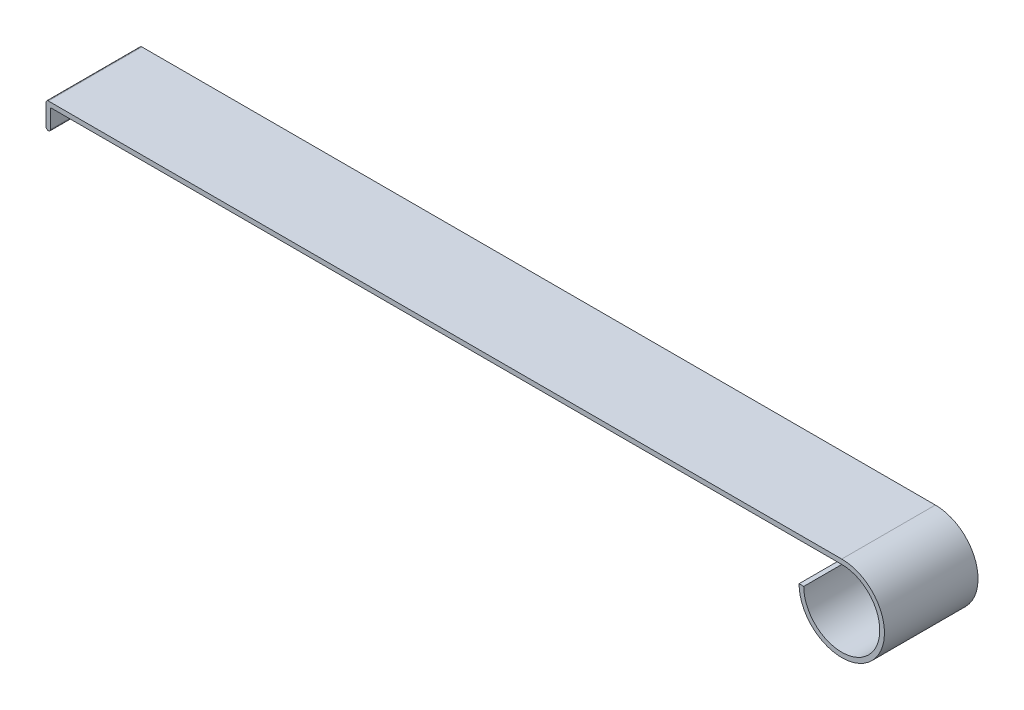
ISO-10303-21;
HEADER;
FILE_DESCRIPTION(('STEP AP214'),'2;1');
FILE_NAME('part.step','',(''),(''),'','','');
FILE_SCHEMA(('AUTOMOTIVE_DESIGN { 1 0 10303 214 1 1 1 1 }'));
ENDSEC;
DATA;
#1=APPLICATION_CONTEXT('core data for automotive mechanical design processes');
#2=APPLICATION_PROTOCOL_DEFINITION('international standard','automotive_design',2000,#1);
#3=PRODUCT_CONTEXT('',#1,'mechanical');
#4=PRODUCT('Part','Part','',(#3));
#5=PRODUCT_RELATED_PRODUCT_CATEGORY('part','',(#4));
#6=PRODUCT_DEFINITION_FORMATION('','',#4);
#7=PRODUCT_DEFINITION_CONTEXT('part definition',#1,'design');
#8=PRODUCT_DEFINITION('design','',#6,#7);
#9=PRODUCT_DEFINITION_SHAPE('','',#8);
#10=(LENGTH_UNIT() NAMED_UNIT(*) SI_UNIT(.MILLI.,.METRE.));
#11=(NAMED_UNIT(*) PLANE_ANGLE_UNIT() SI_UNIT($,.RADIAN.));
#12=(NAMED_UNIT(*) SI_UNIT($,.STERADIAN.) SOLID_ANGLE_UNIT());
#13=UNCERTAINTY_MEASURE_WITH_UNIT(LENGTH_MEASURE(1.E-05),#10,'distance_accuracy_value','');
#14=(GEOMETRIC_REPRESENTATION_CONTEXT(3) GLOBAL_UNCERTAINTY_ASSIGNED_CONTEXT((#13)) GLOBAL_UNIT_ASSIGNED_CONTEXT((#10,
#11,#12)) REPRESENTATION_CONTEXT('',''));
#15=CARTESIAN_POINT('',(0.,0.,0.));
#16=DIRECTION('',(0.,0.,1.));
#17=DIRECTION('',(1.,0.,0.));
#18=AXIS2_PLACEMENT_3D('',#15,#16,#17);
#19=CARTESIAN_POINT('',(0.,0.,4.));
#20=DIRECTION('',(0.,0.,-1.));
#21=DIRECTION('',(-1.,0.,0.));
#22=AXIS2_PLACEMENT_3D('',#19,#20,#21);
#23=CYLINDRICAL_SURFACE('',#22,0.1);
#24=CARTESIAN_POINT('',(0.,0.,0.));
#25=DIRECTION('',(0.,0.,1.));
#26=DIRECTION('',(1.,0.,0.));
#27=AXIS2_PLACEMENT_3D('',#24,#25,#26);
#28=CIRCLE('',#27,0.1);
#29=CARTESIAN_POINT('',(-0.1,0.,0.));
#30=VERTEX_POINT('',#29);
#31=CARTESIAN_POINT('',(0.1,0.,0.));
#32=VERTEX_POINT('',#31);
#33=EDGE_CURVE('E136',#30,#32,#28,.T.);
#34=ORIENTED_EDGE('',*,*,#33,.T.);
#35=DIRECTION('',(0.,0.,-1.));
#36=VECTOR('',#35,1.);
#37=CARTESIAN_POINT('',(0.1,0.,4.));
#38=LINE('',#37,#36);
#39=CARTESIAN_POINT('',(0.1,0.,4.));
#40=VERTEX_POINT('',#39);
#41=EDGE_CURVE('E11',#40,#32,#38,.T.);
#42=ORIENTED_EDGE('',*,*,#41,.F.);
#43=CARTESIAN_POINT('',(0.,0.,4.));
#44=DIRECTION('',(0.,0.,1.));
#45=DIRECTION('',(1.,0.,0.));
#46=AXIS2_PLACEMENT_3D('',#43,#44,#45);
#47=CIRCLE('',#46,0.1);
#48=CARTESIAN_POINT('',(-0.1,0.,4.));
#49=VERTEX_POINT('',#48);
#50=EDGE_CURVE('E154',#49,#40,#47,.T.);
#51=ORIENTED_EDGE('',*,*,#50,.F.);
#52=DIRECTION('',(0.,0.,-1.));
#53=VECTOR('',#52,1.);
#54=CARTESIAN_POINT('',(-0.1,0.,4.));
#55=LINE('',#54,#53);
#56=EDGE_CURVE('E132',#49,#30,#55,.T.);
#57=ORIENTED_EDGE('',*,*,#56,.T.);
#58=EDGE_LOOP('',(#34,#42,#51,#57));
#59=FACE_BOUND('',#58,.T.);
#60=ADVANCED_FACE('F33',(#59),#23,.T.);
#61=CARTESIAN_POINT('',(0.1,0.,4.));
#62=DIRECTION('',(-1.,0.,0.));
#63=DIRECTION('',(0.,0.,1.));
#64=AXIS2_PLACEMENT_3D('',#61,#62,#63);
#65=PLANE('',#64);
#66=DIRECTION('',(0.,1.,0.));
#67=VECTOR('',#66,1.);
#68=CARTESIAN_POINT('',(0.1,0.,0.));
#69=LINE('',#68,#67);
#70=CARTESIAN_POINT('',(0.1,0.8,0.));
#71=VERTEX_POINT('',#70);
#72=EDGE_CURVE('E139',#32,#71,#69,.T.);
#73=ORIENTED_EDGE('',*,*,#72,.T.);
#74=DIRECTION('',(0.,0.,-1.));
#75=VECTOR('',#74,1.);
#76=CARTESIAN_POINT('',(0.1,0.8,4.));
#77=LINE('',#76,#75);
#78=CARTESIAN_POINT('',(0.1,0.8,4.));
#79=VERTEX_POINT('',#78);
#80=EDGE_CURVE('E41',#79,#71,#77,.T.);
#81=ORIENTED_EDGE('',*,*,#80,.F.);
#82=DIRECTION('',(0.,1.,0.));
#83=VECTOR('',#82,1.);
#84=CARTESIAN_POINT('',(0.1,0.,4.));
#85=LINE('',#84,#83);
#86=EDGE_CURVE('E93',#40,#79,#85,.T.);
#87=ORIENTED_EDGE('',*,*,#86,.F.);
#88=ORIENTED_EDGE('',*,*,#41,.T.);
#89=EDGE_LOOP('',(#73,#81,#87,#88));
#90=FACE_BOUND('',#89,.T.);
#91=ADVANCED_FACE('F172',(#90),#65,.F.);
#92=CARTESIAN_POINT('',(33.077498182658,0.8,4.));
#93=DIRECTION('',(0.,1.,0.));
#94=DIRECTION('',(-1.,0.,0.));
#95=AXIS2_PLACEMENT_3D('',#92,#93,#94);
#96=PLANE('',#95);
#97=DIRECTION('',(1.,0.,0.));
#98=VECTOR('',#97,1.);
#99=CARTESIAN_POINT('',(33.077498182658,0.8,0.));
#100=LINE('',#99,#98);
#101=CARTESIAN_POINT('',(33.9080828748774,0.799999999999997,0.));
#102=VERTEX_POINT('',#101);
#103=EDGE_CURVE('E142',#71,#102,#100,.T.);
#104=ORIENTED_EDGE('',*,*,#103,.T.);
#105=DIRECTION('',(0.,0.,-1.));
#106=VECTOR('',#105,1.);
#107=CARTESIAN_POINT('',(33.9080828748774,0.799999999999997,4.));
#108=LINE('',#107,#106);
#109=CARTESIAN_POINT('',(33.9080828748774,0.799999999999997,4.));
#110=VERTEX_POINT('',#109);
#111=EDGE_CURVE('E164',#110,#102,#108,.T.);
#112=ORIENTED_EDGE('',*,*,#111,.F.);
#113=DIRECTION('',(1.,0.,0.));
#114=VECTOR('',#113,1.);
#115=CARTESIAN_POINT('',(0.1,0.8,4.));
#116=LINE('',#115,#114);
#117=EDGE_CURVE('E171',#79,#110,#116,.T.);
#118=ORIENTED_EDGE('',*,*,#117,.F.);
#119=ORIENTED_EDGE('',*,*,#80,.T.);
#120=EDGE_LOOP('',(#104,#112,#118,#119));
#121=FACE_BOUND('',#120,.T.);
#122=ADVANCED_FACE('F169',(#121),#96,.F.);
#123=CARTESIAN_POINT('',(33.9080828748774,-0.824677327373322,4.));
#124=DIRECTION('',(0.,0.,-1.));
#125=DIRECTION('',(-1.,0.,0.));
#126=AXIS2_PLACEMENT_3D('',#123,#124,#125);
#127=CYLINDRICAL_SURFACE('',#126,1.62467732737332);
#128=CARTESIAN_POINT('',(33.9080828748774,-0.824677327373322,0.));
#129=DIRECTION('',(0.,0.,-1.));
#130=DIRECTION('',(1.,0.,0.));
#131=AXIS2_PLACEMENT_3D('',#128,#129,#130);
#132=CIRCLE('',#131,1.62467732737332);
#133=CARTESIAN_POINT('',(32.2834055475041,-0.824677327373322,0.));
#134=VERTEX_POINT('',#133);
#135=EDGE_CURVE('E144',#102,#134,#132,.T.);
#136=ORIENTED_EDGE('',*,*,#135,.T.);
#137=DIRECTION('',(0.,0.,-1.));
#138=VECTOR('',#137,1.);
#139=CARTESIAN_POINT('',(32.2834055475041,-0.824677327373322,4.));
#140=LINE('',#139,#138);
#141=CARTESIAN_POINT('',(32.2834055475041,-0.824677327373322,4.));
#142=VERTEX_POINT('',#141);
#143=EDGE_CURVE('E161',#142,#134,#140,.T.);
#144=ORIENTED_EDGE('',*,*,#143,.F.);
#145=CARTESIAN_POINT('',(33.9080828748774,-0.824677327373322,4.));
#146=DIRECTION('',(0.,0.,-1.));
#147=DIRECTION('',(1.,0.,0.));
#148=AXIS2_PLACEMENT_3D('',#145,#146,#147);
#149=CIRCLE('',#148,1.62467732737332);
#150=EDGE_CURVE('E187',#110,#142,#149,.T.);
#151=ORIENTED_EDGE('',*,*,#150,.F.);
#152=ORIENTED_EDGE('',*,*,#111,.T.);
#153=EDGE_LOOP('',(#136,#144,#151,#152));
#154=FACE_BOUND('',#153,.T.);
#155=ADVANCED_FACE('F180',(#154),#127,.F.);
#156=CARTESIAN_POINT('',(32.2834055475041,-0.824677327373322,4.));
#157=DIRECTION('',(0.,-1.,0.));
#158=DIRECTION('',(0.,0.,-1.));
#159=AXIS2_PLACEMENT_3D('',#156,#157,#158);
#160=PLANE('',#159);
#161=DIRECTION('',(-1.,0.,0.));
#162=VECTOR('',#161,1.);
#163=CARTESIAN_POINT('',(32.2834055475041,-0.824677327373322,0.));
#164=LINE('',#163,#162);
#165=CARTESIAN_POINT('',(32.0834055475041,-0.824677327373322,0.));
#166=VERTEX_POINT('',#165);
#167=EDGE_CURVE('E146',#134,#166,#164,.T.);
#168=ORIENTED_EDGE('',*,*,#167,.T.);
#169=DIRECTION('',(0.,0.,-1.));
#170=VECTOR('',#169,1.);
#171=CARTESIAN_POINT('',(32.0834055475041,-0.824677327373322,4.));
#172=LINE('',#171,#170);
#173=CARTESIAN_POINT('',(32.0834055475041,-0.824677327373322,4.));
#174=VERTEX_POINT('',#173);
#175=EDGE_CURVE('E158',#174,#166,#172,.T.);
#176=ORIENTED_EDGE('',*,*,#175,.F.);
#177=DIRECTION('',(-1.,0.,0.));
#178=VECTOR('',#177,1.);
#179=CARTESIAN_POINT('',(32.2834055475041,-0.824677327373322,4.));
#180=LINE('',#179,#178);
#181=EDGE_CURVE('E186',#142,#174,#180,.T.);
#182=ORIENTED_EDGE('',*,*,#181,.F.);
#183=ORIENTED_EDGE('',*,*,#143,.T.);
#184=EDGE_LOOP('',(#168,#176,#182,#183));
#185=FACE_BOUND('',#184,.T.);
#186=ADVANCED_FACE('F184',(#185),#160,.F.);
#187=CARTESIAN_POINT('',(33.9080828748774,-0.824677327373322,4.));
#188=DIRECTION('',(0.,0.,-1.));
#189=DIRECTION('',(-1.,0.,0.));
#190=AXIS2_PLACEMENT_3D('',#187,#188,#189);
#191=CYLINDRICAL_SURFACE('',#190,1.82467732737332);
#192=CARTESIAN_POINT('',(33.9080828748774,-0.824677327373322,0.));
#193=DIRECTION('',(0.,0.,1.));
#194=DIRECTION('',(1.,0.,0.));
#195=AXIS2_PLACEMENT_3D('',#192,#193,#194);
#196=CIRCLE('',#195,1.82467732737332);
#197=CARTESIAN_POINT('',(33.9080828748774,0.999999999999999,0.));
#198=VERTEX_POINT('',#197);
#199=EDGE_CURVE('E148',#166,#198,#196,.T.);
#200=ORIENTED_EDGE('',*,*,#199,.T.);
#201=DIRECTION('',(0.,0.,-1.));
#202=VECTOR('',#201,1.);
#203=CARTESIAN_POINT('',(33.9080828748774,0.999999999999999,4.));
#204=LINE('',#203,#202);
#205=CARTESIAN_POINT('',(33.9080828748774,0.999999999999999,4.));
#206=VERTEX_POINT('',#205);
#207=EDGE_CURVE('E127',#206,#198,#204,.T.);
#208=ORIENTED_EDGE('',*,*,#207,.F.);
#209=CARTESIAN_POINT('',(33.9080828748774,-0.824677327373322,4.));
#210=DIRECTION('',(0.,0.,1.));
#211=DIRECTION('',(1.,0.,0.));
#212=AXIS2_PLACEMENT_3D('',#209,#210,#211);
#213=CIRCLE('',#212,1.82467732737332);
#214=EDGE_CURVE('E116',#174,#206,#213,.T.);
#215=ORIENTED_EDGE('',*,*,#214,.F.);
#216=ORIENTED_EDGE('',*,*,#175,.T.);
#217=EDGE_LOOP('',(#200,#208,#215,#216));
#218=FACE_BOUND('',#217,.T.);
#219=ADVANCED_FACE('F218',(#218),#191,.T.);
#220=CARTESIAN_POINT('',(0.,1.,4.));
#221=DIRECTION('',(0.,-1.,0.));
#222=DIRECTION('',(0.,0.,-1.));
#223=AXIS2_PLACEMENT_3D('',#220,#221,#222);
#224=PLANE('',#223);
#225=DIRECTION('',(-1.,0.,0.));
#226=VECTOR('',#225,1.);
#227=CARTESIAN_POINT('',(0.,1.,0.));
#228=LINE('',#227,#226);
#229=CARTESIAN_POINT('',(0.,1.,0.));
#230=VERTEX_POINT('',#229);
#231=EDGE_CURVE('E125',#198,#230,#228,.T.);
#232=ORIENTED_EDGE('',*,*,#231,.T.);
#233=DIRECTION('',(0.,0.,-1.));
#234=VECTOR('',#233,1.);
#235=CARTESIAN_POINT('',(0.,1.,4.));
#236=LINE('',#235,#234);
#237=CARTESIAN_POINT('',(0.,1.,4.));
#238=VERTEX_POINT('',#237);
#239=EDGE_CURVE('E122',#238,#230,#236,.T.);
#240=ORIENTED_EDGE('',*,*,#239,.F.);
#241=DIRECTION('',(-1.,0.,0.));
#242=VECTOR('',#241,1.);
#243=CARTESIAN_POINT('',(0.,1.,4.));
#244=LINE('',#243,#242);
#245=EDGE_CURVE('E109',#206,#238,#244,.T.);
#246=ORIENTED_EDGE('',*,*,#245,.F.);
#247=ORIENTED_EDGE('',*,*,#207,.T.);
#248=EDGE_LOOP('',(#232,#240,#246,#247));
#249=FACE_BOUND('',#248,.T.);
#250=ADVANCED_FACE('F123',(#249),#224,.F.);
#251=CARTESIAN_POINT('',(0.,0.9,4.));
#252=DIRECTION('',(0.,0.,-1.));
#253=DIRECTION('',(-1.,0.,0.));
#254=AXIS2_PLACEMENT_3D('',#251,#252,#253);
#255=CYLINDRICAL_SURFACE('',#254,0.1);
#256=CARTESIAN_POINT('',(0.,0.9,0.));
#257=DIRECTION('',(0.,0.,1.));
#258=DIRECTION('',(1.,0.,0.));
#259=AXIS2_PLACEMENT_3D('',#256,#257,#258);
#260=CIRCLE('',#259,0.1);
#261=CARTESIAN_POINT('',(-0.1,0.9,0.));
#262=VERTEX_POINT('',#261);
#263=EDGE_CURVE('E151',#230,#262,#260,.T.);
#264=ORIENTED_EDGE('',*,*,#263,.T.);
#265=DIRECTION('',(0.,0.,-1.));
#266=VECTOR('',#265,1.);
#267=CARTESIAN_POINT('',(-0.1,0.9,4.));
#268=LINE('',#267,#266);
#269=CARTESIAN_POINT('',(-0.1,0.9,4.));
#270=VERTEX_POINT('',#269);
#271=EDGE_CURVE('E128',#270,#262,#268,.T.);
#272=ORIENTED_EDGE('',*,*,#271,.F.);
#273=CARTESIAN_POINT('',(0.,0.9,4.));
#274=DIRECTION('',(0.,0.,1.));
#275=DIRECTION('',(1.,0.,0.));
#276=AXIS2_PLACEMENT_3D('',#273,#274,#275);
#277=CIRCLE('',#276,0.1);
#278=EDGE_CURVE('E113',#238,#270,#277,.T.);
#279=ORIENTED_EDGE('',*,*,#278,.F.);
#280=ORIENTED_EDGE('',*,*,#239,.T.);
#281=EDGE_LOOP('',(#264,#272,#279,#280));
#282=FACE_BOUND('',#281,.T.);
#283=ADVANCED_FACE('F130',(#282),#255,.T.);
#284=CARTESIAN_POINT('',(-0.1,0.,4.));
#285=DIRECTION('',(1.,0.,0.));
#286=DIRECTION('',(0.,0.,-1.));
#287=AXIS2_PLACEMENT_3D('',#284,#285,#286);
#288=PLANE('',#287);
#289=DIRECTION('',(0.,-1.,0.));
#290=VECTOR('',#289,1.);
#291=CARTESIAN_POINT('',(-0.1,0.,0.));
#292=LINE('',#291,#290);
#293=EDGE_CURVE('E81',#262,#30,#292,.T.);
#294=ORIENTED_EDGE('',*,*,#293,.T.);
#295=ORIENTED_EDGE('',*,*,#56,.F.);
#296=DIRECTION('',(0.,-1.,0.));
#297=VECTOR('',#296,1.);
#298=CARTESIAN_POINT('',(-0.1,0.8,4.));
#299=LINE('',#298,#297);
#300=EDGE_CURVE('E49',#270,#49,#299,.T.);
#301=ORIENTED_EDGE('',*,*,#300,.F.);
#302=ORIENTED_EDGE('',*,*,#271,.T.);
#303=EDGE_LOOP('',(#294,#295,#301,#302));
#304=FACE_BOUND('',#303,.T.);
#305=ADVANCED_FACE('F195',(#304),#288,.F.);
#306=CARTESIAN_POINT('',(0.,0.,4.));
#307=DIRECTION('',(0.,0.,1.));
#308=DIRECTION('',(1.,0.,0.));
#309=AXIS2_PLACEMENT_3D('',#306,#307,#308);
#310=PLANE('',#309);
#311=ORIENTED_EDGE('',*,*,#50,.T.);
#312=ORIENTED_EDGE('',*,*,#86,.T.);
#313=ORIENTED_EDGE('',*,*,#117,.T.);
#314=ORIENTED_EDGE('',*,*,#150,.T.);
#315=ORIENTED_EDGE('',*,*,#181,.T.);
#316=ORIENTED_EDGE('',*,*,#214,.T.);
#317=ORIENTED_EDGE('',*,*,#245,.T.);
#318=ORIENTED_EDGE('',*,*,#278,.T.);
#319=ORIENTED_EDGE('',*,*,#300,.T.);
#320=EDGE_LOOP('',(#311,#312,#313,#314,#315,#316,#317,#318,#319));
#321=FACE_BOUND('',#320,.T.);
#322=ADVANCED_FACE('F111',(#321),#310,.T.);
#323=CARTESIAN_POINT('',(0.,0.,0.));
#324=DIRECTION('',(0.,0.,1.));
#325=DIRECTION('',(1.,0.,0.));
#326=AXIS2_PLACEMENT_3D('',#323,#324,#325);
#327=PLANE('',#326);
#328=ORIENTED_EDGE('',*,*,#33,.F.);
#329=ORIENTED_EDGE('',*,*,#293,.F.);
#330=ORIENTED_EDGE('',*,*,#263,.F.);
#331=ORIENTED_EDGE('',*,*,#231,.F.);
#332=ORIENTED_EDGE('',*,*,#199,.F.);
#333=ORIENTED_EDGE('',*,*,#167,.F.);
#334=ORIENTED_EDGE('',*,*,#135,.F.);
#335=ORIENTED_EDGE('',*,*,#103,.F.);
#336=ORIENTED_EDGE('',*,*,#72,.F.);
#337=EDGE_LOOP('',(#328,#329,#330,#331,#332,#333,#334,#335,#336));
#338=FACE_BOUND('',#337,.T.);
#339=ADVANCED_FACE('F174',(#338),#327,.F.);
#340=CLOSED_SHELL('',(#60,#91,#122,#155,#186,#219,#250,#283,#305,#322,#339));
#341=MANIFOLD_SOLID_BREP('B2',#340);
#342=ADVANCED_BREP_SHAPE_REPRESENTATION('',(#18,#341),#14);
#343=SHAPE_DEFINITION_REPRESENTATION(#9,#342);
ENDSEC;
END-ISO-10303-21;
